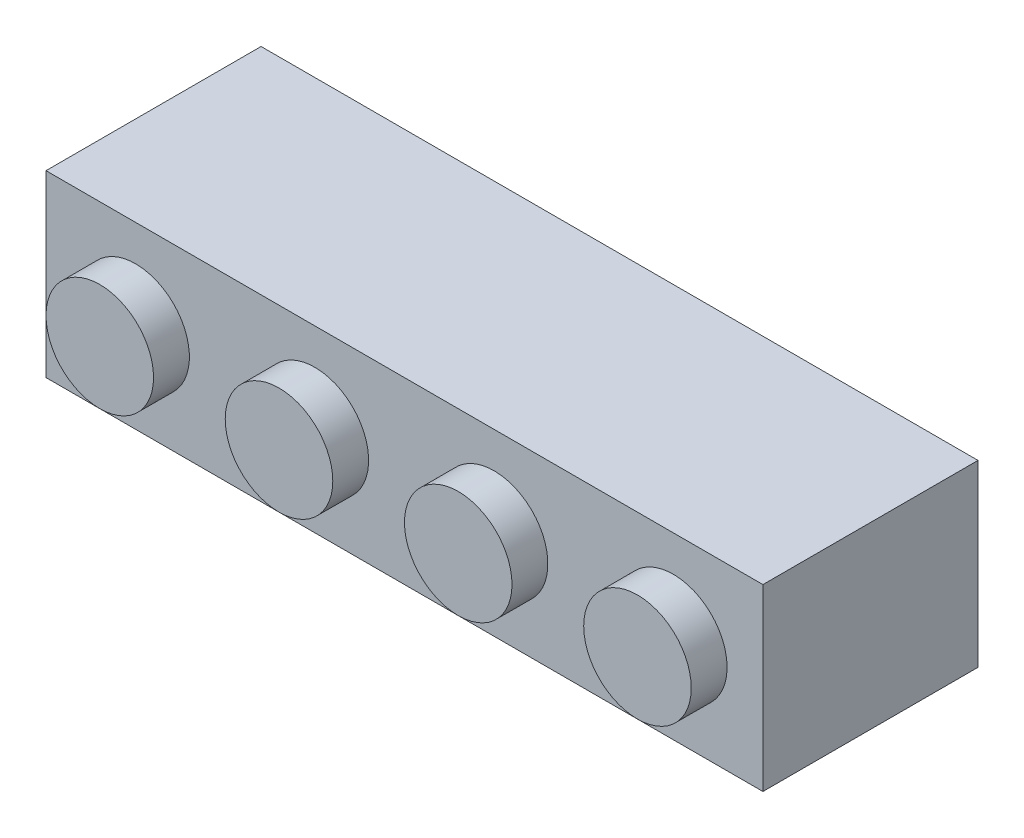
ISO-10303-21;
HEADER;
FILE_DESCRIPTION(('STEP AP214'),'2;1');
FILE_NAME('part.step','',(''),(''),'','','');
FILE_SCHEMA(('AUTOMOTIVE_DESIGN { 1 0 10303 214 1 1 1 1 }'));
ENDSEC;
DATA;
#1=APPLICATION_CONTEXT('core data for automotive mechanical design processes');
#2=APPLICATION_PROTOCOL_DEFINITION('international standard','automotive_design',2000,#1);
#3=PRODUCT_CONTEXT('',#1,'mechanical');
#4=PRODUCT('Part','Part','',(#3));
#5=PRODUCT_RELATED_PRODUCT_CATEGORY('part','',(#4));
#6=PRODUCT_DEFINITION_FORMATION('','',#4);
#7=PRODUCT_DEFINITION_CONTEXT('part definition',#1,'design');
#8=PRODUCT_DEFINITION('design','',#6,#7);
#9=PRODUCT_DEFINITION_SHAPE('','',#8);
#10=(LENGTH_UNIT() NAMED_UNIT(*) SI_UNIT(.MILLI.,.METRE.));
#11=(NAMED_UNIT(*) PLANE_ANGLE_UNIT() SI_UNIT($,.RADIAN.));
#12=(NAMED_UNIT(*) SI_UNIT($,.STERADIAN.) SOLID_ANGLE_UNIT());
#13=UNCERTAINTY_MEASURE_WITH_UNIT(LENGTH_MEASURE(1.E-05),#10,'distance_accuracy_value','');
#14=(GEOMETRIC_REPRESENTATION_CONTEXT(3) GLOBAL_UNCERTAINTY_ASSIGNED_CONTEXT((#13)) GLOBAL_UNIT_ASSIGNED_CONTEXT((#10,
#11,#12)) REPRESENTATION_CONTEXT('',''));
#15=CARTESIAN_POINT('',(0.,0.,0.));
#16=DIRECTION('',(0.,0.,1.));
#17=DIRECTION('',(1.,0.,0.));
#18=AXIS2_PLACEMENT_3D('',#15,#16,#17);
#19=CARTESIAN_POINT('',(0.,0.,8.));
#20=DIRECTION('',(0.,0.,-1.));
#21=DIRECTION('',(-1.,0.,0.));
#22=AXIS2_PLACEMENT_3D('',#19,#20,#21);
#23=PLANE('',#22);
#24=CARTESIAN_POINT('',(16.,4.,8.));
#25=DIRECTION('',(0.,0.,-1.));
#26=DIRECTION('',(-1.,0.,0.));
#27=AXIS2_PLACEMENT_3D('',#24,#25,#26);
#28=CIRCLE('',#27,1.6);
#29=CARTESIAN_POINT('',(14.4,4.,8.));
#30=VERTEX_POINT('',#29);
#31=EDGE_CURVE('E515',#30,#30,#28,.T.);
#32=ORIENTED_EDGE('',*,*,#31,.F.);
#33=EDGE_LOOP('',(#32));
#34=FACE_BOUND('',#33,.T.);
#35=CARTESIAN_POINT('',(28.,4.,8.));
#36=DIRECTION('',(0.,0.,-1.));
#37=DIRECTION('',(-1.,0.,0.));
#38=AXIS2_PLACEMENT_3D('',#35,#36,#37);
#39=CIRCLE('',#38,0.800000000000001);
#40=CARTESIAN_POINT('',(27.2,4.,8.));
#41=VERTEX_POINT('',#40);
#42=EDGE_CURVE('E140',#41,#41,#39,.F.);
#43=ORIENTED_EDGE('',*,*,#42,.T.);
#44=EDGE_LOOP('',(#43));
#45=FACE_BOUND('',#44,.T.);
#46=CARTESIAN_POINT('',(20.,4.,8.));
#47=DIRECTION('',(0.,0.,-1.));
#48=DIRECTION('',(-1.,0.,0.));
#49=AXIS2_PLACEMENT_3D('',#46,#47,#48);
#50=CIRCLE('',#49,0.800000000000001);
#51=CARTESIAN_POINT('',(19.2,4.,8.));
#52=VERTEX_POINT('',#51);
#53=EDGE_CURVE('E135',#52,#52,#50,.F.);
#54=ORIENTED_EDGE('',*,*,#53,.T.);
#55=EDGE_LOOP('',(#54));
#56=FACE_BOUND('',#55,.T.);
#57=CARTESIAN_POINT('',(12.,4.,8.));
#58=DIRECTION('',(0.,0.,-1.));
#59=DIRECTION('',(-1.,0.,0.));
#60=AXIS2_PLACEMENT_3D('',#57,#58,#59);
#61=CIRCLE('',#60,0.800000000000001);
#62=CARTESIAN_POINT('',(11.2,4.,8.));
#63=VERTEX_POINT('',#62);
#64=EDGE_CURVE('E132',#63,#63,#61,.F.);
#65=ORIENTED_EDGE('',*,*,#64,.T.);
#66=EDGE_LOOP('',(#65));
#67=FACE_BOUND('',#66,.T.);
#68=DIRECTION('',(0.,-1.,0.));
#69=VECTOR('',#68,1.);
#70=CARTESIAN_POINT('',(1.6,0.,8.));
#71=LINE('',#70,#69);
#72=CARTESIAN_POINT('',(1.6,6.4,8.));
#73=VERTEX_POINT('',#72);
#74=CARTESIAN_POINT('',(1.6,1.6,8.));
#75=VERTEX_POINT('',#74);
#76=EDGE_CURVE('E118',#73,#75,#71,.T.);
#77=ORIENTED_EDGE('',*,*,#76,.F.);
#78=DIRECTION('',(-1.,0.,0.));
#79=VECTOR('',#78,1.);
#80=CARTESIAN_POINT('',(0.,6.4,8.));
#81=LINE('',#80,#79);
#82=CARTESIAN_POINT('',(30.4,6.4,8.));
#83=VERTEX_POINT('',#82);
#84=EDGE_CURVE('E126',#83,#73,#81,.T.);
#85=ORIENTED_EDGE('',*,*,#84,.F.);
#86=DIRECTION('',(0.,1.,0.));
#87=VECTOR('',#86,1.);
#88=CARTESIAN_POINT('',(30.4,0.,8.));
#89=LINE('',#88,#87);
#90=CARTESIAN_POINT('',(30.4,1.6,8.));
#91=VERTEX_POINT('',#90);
#92=EDGE_CURVE('E117',#91,#83,#89,.T.);
#93=ORIENTED_EDGE('',*,*,#92,.F.);
#94=DIRECTION('',(1.,0.,0.));
#95=VECTOR('',#94,1.);
#96=CARTESIAN_POINT('',(0.,1.6,8.));
#97=LINE('',#96,#95);
#98=EDGE_CURVE('E107',#75,#91,#97,.T.);
#99=ORIENTED_EDGE('',*,*,#98,.F.);
#100=EDGE_LOOP('',(#77,#85,#93,#99));
#101=FACE_BOUND('',#100,.T.);
#102=CARTESIAN_POINT('',(4.,4.,8.));
#103=DIRECTION('',(0.,0.,-1.));
#104=DIRECTION('',(-1.,0.,0.));
#105=AXIS2_PLACEMENT_3D('',#102,#103,#104);
#106=CIRCLE('',#105,0.800000000000001);
#107=CARTESIAN_POINT('',(3.2,4.,8.));
#108=VERTEX_POINT('',#107);
#109=EDGE_CURVE('E136',#108,#108,#106,.F.);
#110=ORIENTED_EDGE('',*,*,#109,.T.);
#111=EDGE_LOOP('',(#110));
#112=FACE_BOUND('',#111,.T.);
#113=CARTESIAN_POINT('',(8.,4.,8.));
#114=DIRECTION('',(0.,0.,-1.));
#115=DIRECTION('',(-1.,0.,0.));
#116=AXIS2_PLACEMENT_3D('',#113,#114,#115);
#117=CIRCLE('',#116,1.6);
#118=CARTESIAN_POINT('',(6.4,4.,8.));
#119=VERTEX_POINT('',#118);
#120=EDGE_CURVE('E526',#119,#119,#117,.T.);
#121=ORIENTED_EDGE('',*,*,#120,.F.);
#122=EDGE_LOOP('',(#121));
#123=FACE_BOUND('',#122,.T.);
#124=CARTESIAN_POINT('',(24.,4.,8.));
#125=DIRECTION('',(0.,0.,-1.));
#126=DIRECTION('',(-1.,0.,0.));
#127=AXIS2_PLACEMENT_3D('',#124,#125,#126);
#128=CIRCLE('',#127,1.6);
#129=CARTESIAN_POINT('',(22.4,4.,8.));
#130=VERTEX_POINT('',#129);
#131=EDGE_CURVE('E516',#130,#130,#128,.T.);
#132=ORIENTED_EDGE('',*,*,#131,.F.);
#133=EDGE_LOOP('',(#132));
#134=FACE_BOUND('',#133,.T.);
#135=ADVANCED_FACE('F32',(#34,#45,#56,#67,#101,#112,#123,#134),#23,.T.);
#136=CARTESIAN_POINT('',(0.,0.,0.));
#137=DIRECTION('',(0.,0.,-1.));
#138=DIRECTION('',(-1.,0.,0.));
#139=AXIS2_PLACEMENT_3D('',#136,#137,#138);
#140=PLANE('',#139);
#141=DIRECTION('',(0.,-1.,0.));
#142=VECTOR('',#141,1.);
#143=CARTESIAN_POINT('',(0.,0.,0.));
#144=LINE('',#143,#142);
#145=CARTESIAN_POINT('',(0.,8.,0.));
#146=VERTEX_POINT('',#145);
#147=CARTESIAN_POINT('',(0.,0.,0.));
#148=VERTEX_POINT('',#147);
#149=EDGE_CURVE('E173',#146,#148,#144,.T.);
#150=ORIENTED_EDGE('',*,*,#149,.F.);
#151=DIRECTION('',(-1.,0.,0.));
#152=VECTOR('',#151,1.);
#153=CARTESIAN_POINT('',(0.,8.,0.));
#154=LINE('',#153,#152);
#155=CARTESIAN_POINT('',(32.,8.,0.));
#156=VERTEX_POINT('',#155);
#157=EDGE_CURVE('E77',#156,#146,#154,.T.);
#158=ORIENTED_EDGE('',*,*,#157,.F.);
#159=DIRECTION('',(0.,1.,0.));
#160=VECTOR('',#159,1.);
#161=CARTESIAN_POINT('',(32.,0.,0.));
#162=LINE('',#161,#160);
#163=CARTESIAN_POINT('',(32.,0.,0.));
#164=VERTEX_POINT('',#163);
#165=EDGE_CURVE('E185',#164,#156,#162,.T.);
#166=ORIENTED_EDGE('',*,*,#165,.F.);
#167=DIRECTION('',(1.,0.,0.));
#168=VECTOR('',#167,1.);
#169=CARTESIAN_POINT('',(0.,0.,0.));
#170=LINE('',#169,#168);
#171=EDGE_CURVE('E183',#148,#164,#170,.T.);
#172=ORIENTED_EDGE('',*,*,#171,.F.);
#173=EDGE_LOOP('',(#150,#158,#166,#172));
#174=FACE_BOUND('',#173,.T.);
#175=DIRECTION('',(-1.,0.,0.));
#176=VECTOR('',#175,1.);
#177=CARTESIAN_POINT('',(0.,6.4,0.));
#178=LINE('',#177,#176);
#179=CARTESIAN_POINT('',(30.4,6.4,0.));
#180=VERTEX_POINT('',#179);
#181=CARTESIAN_POINT('',(1.6,6.4,0.));
#182=VERTEX_POINT('',#181);
#183=EDGE_CURVE('E163',#180,#182,#178,.T.);
#184=ORIENTED_EDGE('',*,*,#183,.T.);
#185=DIRECTION('',(0.,-1.,0.));
#186=VECTOR('',#185,1.);
#187=CARTESIAN_POINT('',(1.6,0.,0.));
#188=LINE('',#187,#186);
#189=CARTESIAN_POINT('',(1.6,1.6,0.));
#190=VERTEX_POINT('',#189);
#191=EDGE_CURVE('E150',#182,#190,#188,.T.);
#192=ORIENTED_EDGE('',*,*,#191,.T.);
#193=DIRECTION('',(1.,0.,0.));
#194=VECTOR('',#193,1.);
#195=CARTESIAN_POINT('',(0.,1.6,0.));
#196=LINE('',#195,#194);
#197=CARTESIAN_POINT('',(30.4,1.6,0.));
#198=VERTEX_POINT('',#197);
#199=EDGE_CURVE('E162',#190,#198,#196,.T.);
#200=ORIENTED_EDGE('',*,*,#199,.T.);
#201=DIRECTION('',(0.,1.,0.));
#202=VECTOR('',#201,1.);
#203=CARTESIAN_POINT('',(30.4,0.,0.));
#204=LINE('',#203,#202);
#205=EDGE_CURVE('E47',#198,#180,#204,.T.);
#206=ORIENTED_EDGE('',*,*,#205,.T.);
#207=EDGE_LOOP('',(#184,#192,#200,#206));
#208=FACE_BOUND('',#207,.T.);
#209=ADVANCED_FACE('F215',(#174,#208),#140,.T.);
#210=CARTESIAN_POINT('',(0.,0.,9.6));
#211=DIRECTION('',(0.,0.,-1.));
#212=DIRECTION('',(-1.,0.,0.));
#213=AXIS2_PLACEMENT_3D('',#210,#211,#212);
#214=PLANE('',#213);
#215=CARTESIAN_POINT('',(4.,4.,9.6));
#216=DIRECTION('',(0.,0.,-1.));
#217=DIRECTION('',(-1.,0.,0.));
#218=AXIS2_PLACEMENT_3D('',#215,#216,#217);
#219=CIRCLE('',#218,2.4);
#220=CARTESIAN_POINT('',(1.6,4.,9.6));
#221=VERTEX_POINT('',#220);
#222=EDGE_CURVE('E196',#221,#221,#219,.F.);
#223=ORIENTED_EDGE('',*,*,#222,.F.);
#224=EDGE_LOOP('',(#223));
#225=FACE_BOUND('',#224,.T.);
#226=DIRECTION('',(0.,-1.,0.));
#227=VECTOR('',#226,1.);
#228=CARTESIAN_POINT('',(0.,0.,9.6));
#229=LINE('',#228,#227);
#230=CARTESIAN_POINT('',(0.,8.,9.6));
#231=VERTEX_POINT('',#230);
#232=CARTESIAN_POINT('',(0.,0.,9.6));
#233=VERTEX_POINT('',#232);
#234=EDGE_CURVE('E174',#231,#233,#229,.T.);
#235=ORIENTED_EDGE('',*,*,#234,.T.);
#236=DIRECTION('',(1.,0.,0.));
#237=VECTOR('',#236,1.);
#238=CARTESIAN_POINT('',(0.,0.,9.6));
#239=LINE('',#238,#237);
#240=CARTESIAN_POINT('',(32.,0.,9.6));
#241=VERTEX_POINT('',#240);
#242=EDGE_CURVE('E85',#233,#241,#239,.T.);
#243=ORIENTED_EDGE('',*,*,#242,.T.);
#244=DIRECTION('',(0.,1.,0.));
#245=VECTOR('',#244,1.);
#246=CARTESIAN_POINT('',(32.,0.,9.6));
#247=LINE('',#246,#245);
#248=CARTESIAN_POINT('',(32.,8.,9.6));
#249=VERTEX_POINT('',#248);
#250=EDGE_CURVE('E177',#241,#249,#247,.T.);
#251=ORIENTED_EDGE('',*,*,#250,.T.);
#252=DIRECTION('',(-1.,0.,0.));
#253=VECTOR('',#252,1.);
#254=CARTESIAN_POINT('',(0.,8.,9.6));
#255=LINE('',#254,#253);
#256=EDGE_CURVE('E56',#249,#231,#255,.T.);
#257=ORIENTED_EDGE('',*,*,#256,.T.);
#258=EDGE_LOOP('',(#235,#243,#251,#257));
#259=FACE_BOUND('',#258,.T.);
#260=CARTESIAN_POINT('',(12.,4.,9.6));
#261=DIRECTION('',(0.,0.,-1.));
#262=DIRECTION('',(-1.,0.,0.));
#263=AXIS2_PLACEMENT_3D('',#260,#261,#262);
#264=CIRCLE('',#263,2.4);
#265=CARTESIAN_POINT('',(9.6,4.,9.6));
#266=VERTEX_POINT('',#265);
#267=EDGE_CURVE('E199',#266,#266,#264,.F.);
#268=ORIENTED_EDGE('',*,*,#267,.F.);
#269=EDGE_LOOP('',(#268));
#270=FACE_BOUND('',#269,.T.);
#271=CARTESIAN_POINT('',(20.,4.,9.6));
#272=DIRECTION('',(0.,0.,-1.));
#273=DIRECTION('',(-1.,0.,0.));
#274=AXIS2_PLACEMENT_3D('',#271,#272,#273);
#275=CIRCLE('',#274,2.4);
#276=CARTESIAN_POINT('',(17.6,4.,9.6));
#277=VERTEX_POINT('',#276);
#278=EDGE_CURVE('E202',#277,#277,#275,.F.);
#279=ORIENTED_EDGE('',*,*,#278,.F.);
#280=EDGE_LOOP('',(#279));
#281=FACE_BOUND('',#280,.T.);
#282=CARTESIAN_POINT('',(28.,4.,9.6));
#283=DIRECTION('',(0.,0.,-1.));
#284=DIRECTION('',(-1.,0.,0.));
#285=AXIS2_PLACEMENT_3D('',#282,#283,#284);
#286=CIRCLE('',#285,2.4);
#287=CARTESIAN_POINT('',(25.6,4.,9.6));
#288=VERTEX_POINT('',#287);
#289=EDGE_CURVE('E40',#288,#288,#286,.F.);
#290=ORIENTED_EDGE('',*,*,#289,.F.);
#291=EDGE_LOOP('',(#290));
#292=FACE_BOUND('',#291,.T.);
#293=ADVANCED_FACE('F212',(#225,#259,#270,#281,#292),#214,.F.);
#294=CARTESIAN_POINT('',(0.,0.,9.6));
#295=DIRECTION('',(1.,0.,0.));
#296=DIRECTION('',(0.,0.,-1.));
#297=AXIS2_PLACEMENT_3D('',#294,#295,#296);
#298=PLANE('',#297);
#299=ORIENTED_EDGE('',*,*,#149,.T.);
#300=DIRECTION('',(0.,0.,-1.));
#301=VECTOR('',#300,1.);
#302=CARTESIAN_POINT('',(0.,0.,9.6));
#303=LINE('',#302,#301);
#304=EDGE_CURVE('E194',#233,#148,#303,.T.);
#305=ORIENTED_EDGE('',*,*,#304,.F.);
#306=ORIENTED_EDGE('',*,*,#234,.F.);
#307=DIRECTION('',(0.,0.,-1.));
#308=VECTOR('',#307,1.);
#309=CARTESIAN_POINT('',(0.,8.,9.6));
#310=LINE('',#309,#308);
#311=EDGE_CURVE('E180',#231,#146,#310,.T.);
#312=ORIENTED_EDGE('',*,*,#311,.T.);
#313=EDGE_LOOP('',(#299,#305,#306,#312));
#314=FACE_BOUND('',#313,.T.);
#315=ADVANCED_FACE('F214',(#314),#298,.F.);
#316=CARTESIAN_POINT('',(0.,0.,9.6));
#317=DIRECTION('',(0.,1.,0.));
#318=DIRECTION('',(0.,0.,1.));
#319=AXIS2_PLACEMENT_3D('',#316,#317,#318);
#320=PLANE('',#319);
#321=ORIENTED_EDGE('',*,*,#171,.T.);
#322=DIRECTION('',(0.,0.,-1.));
#323=VECTOR('',#322,1.);
#324=CARTESIAN_POINT('',(32.,0.,9.6));
#325=LINE('',#324,#323);
#326=EDGE_CURVE('E191',#241,#164,#325,.T.);
#327=ORIENTED_EDGE('',*,*,#326,.F.);
#328=ORIENTED_EDGE('',*,*,#242,.F.);
#329=ORIENTED_EDGE('',*,*,#304,.T.);
#330=EDGE_LOOP('',(#321,#327,#328,#329));
#331=FACE_BOUND('',#330,.T.);
#332=ADVANCED_FACE('F222',(#331),#320,.F.);
#333=CARTESIAN_POINT('',(32.,0.,9.6));
#334=DIRECTION('',(-1.,0.,0.));
#335=DIRECTION('',(0.,0.,1.));
#336=AXIS2_PLACEMENT_3D('',#333,#334,#335);
#337=PLANE('',#336);
#338=ORIENTED_EDGE('',*,*,#165,.T.);
#339=DIRECTION('',(0.,0.,-1.));
#340=VECTOR('',#339,1.);
#341=CARTESIAN_POINT('',(32.,8.,9.6));
#342=LINE('',#341,#340);
#343=EDGE_CURVE('E189',#249,#156,#342,.T.);
#344=ORIENTED_EDGE('',*,*,#343,.F.);
#345=ORIENTED_EDGE('',*,*,#250,.F.);
#346=ORIENTED_EDGE('',*,*,#326,.T.);
#347=EDGE_LOOP('',(#338,#344,#345,#346));
#348=FACE_BOUND('',#347,.T.);
#349=ADVANCED_FACE('F303',(#348),#337,.F.);
#350=CARTESIAN_POINT('',(0.,8.,9.6));
#351=DIRECTION('',(0.,-1.,0.));
#352=DIRECTION('',(0.,0.,-1.));
#353=AXIS2_PLACEMENT_3D('',#350,#351,#352);
#354=PLANE('',#353);
#355=ORIENTED_EDGE('',*,*,#157,.T.);
#356=ORIENTED_EDGE('',*,*,#311,.F.);
#357=ORIENTED_EDGE('',*,*,#256,.F.);
#358=ORIENTED_EDGE('',*,*,#343,.T.);
#359=EDGE_LOOP('',(#355,#356,#357,#358));
#360=FACE_BOUND('',#359,.T.);
#361=ADVANCED_FACE('F298',(#360),#354,.F.);
#362=CARTESIAN_POINT('',(4.,4.,11.2));
#363=DIRECTION('',(0.,0.,-1.));
#364=DIRECTION('',(-1.,0.,0.));
#365=AXIS2_PLACEMENT_3D('',#362,#363,#364);
#366=CYLINDRICAL_SURFACE('',#365,2.4);
#367=CARTESIAN_POINT('',(4.,4.,11.2));
#368=DIRECTION('',(0.,0.,1.));
#369=DIRECTION('',(1.,0.,0.));
#370=AXIS2_PLACEMENT_3D('',#367,#368,#369);
#371=CIRCLE('',#370,2.4);
#372=CARTESIAN_POINT('',(6.4,4.,11.2));
#373=VERTEX_POINT('',#372);
#374=EDGE_CURVE('E170',#373,#373,#371,.T.);
#375=ORIENTED_EDGE('',*,*,#374,.F.);
#376=EDGE_LOOP('',(#375));
#377=FACE_BOUND('',#376,.T.);
#378=ORIENTED_EDGE('',*,*,#222,.T.);
#379=EDGE_LOOP('',(#378));
#380=FACE_BOUND('',#379,.T.);
#381=ADVANCED_FACE('F295',(#377,#380),#366,.T.);
#382=CARTESIAN_POINT('',(4.,4.,11.2));
#383=DIRECTION('',(0.,0.,1.));
#384=DIRECTION('',(1.,0.,0.));
#385=AXIS2_PLACEMENT_3D('',#382,#383,#384);
#386=PLANE('',#385);
#387=ORIENTED_EDGE('',*,*,#374,.T.);
#388=EDGE_LOOP('',(#387));
#389=FACE_BOUND('',#388,.T.);
#390=ADVANCED_FACE('F292',(#389),#386,.T.);
#391=CARTESIAN_POINT('',(12.,4.,11.2));
#392=DIRECTION('',(0.,0.,-1.));
#393=DIRECTION('',(-1.,0.,0.));
#394=AXIS2_PLACEMENT_3D('',#391,#392,#393);
#395=CYLINDRICAL_SURFACE('',#394,2.4);
#396=CARTESIAN_POINT('',(12.,4.,11.2));
#397=DIRECTION('',(0.,0.,1.));
#398=DIRECTION('',(1.,0.,0.));
#399=AXIS2_PLACEMENT_3D('',#396,#397,#398);
#400=CIRCLE('',#399,2.4);
#401=CARTESIAN_POINT('',(14.4,4.,11.2));
#402=VERTEX_POINT('',#401);
#403=EDGE_CURVE('E159',#402,#402,#400,.T.);
#404=ORIENTED_EDGE('',*,*,#403,.F.);
#405=EDGE_LOOP('',(#404));
#406=FACE_BOUND('',#405,.T.);
#407=ORIENTED_EDGE('',*,*,#267,.T.);
#408=EDGE_LOOP('',(#407));
#409=FACE_BOUND('',#408,.T.);
#410=ADVANCED_FACE('F288',(#406,#409),#395,.T.);
#411=CARTESIAN_POINT('',(12.,4.,11.2));
#412=DIRECTION('',(0.,0.,1.));
#413=DIRECTION('',(1.,0.,0.));
#414=AXIS2_PLACEMENT_3D('',#411,#412,#413);
#415=PLANE('',#414);
#416=ORIENTED_EDGE('',*,*,#403,.T.);
#417=EDGE_LOOP('',(#416));
#418=FACE_BOUND('',#417,.T.);
#419=ADVANCED_FACE('F284',(#418),#415,.T.);
#420=CARTESIAN_POINT('',(20.,4.,11.2));
#421=DIRECTION('',(0.,0.,1.));
#422=DIRECTION('',(1.,0.,0.));
#423=AXIS2_PLACEMENT_3D('',#420,#421,#422);
#424=PLANE('',#423);
#425=CARTESIAN_POINT('',(20.,4.,11.2));
#426=DIRECTION('',(0.,0.,1.));
#427=DIRECTION('',(1.,0.,0.));
#428=AXIS2_PLACEMENT_3D('',#425,#426,#427);
#429=CIRCLE('',#428,2.4);
#430=CARTESIAN_POINT('',(22.4,4.,11.2));
#431=VERTEX_POINT('',#430);
#432=EDGE_CURVE('E205',#431,#431,#429,.T.);
#433=ORIENTED_EDGE('',*,*,#432,.T.);
#434=EDGE_LOOP('',(#433));
#435=FACE_BOUND('',#434,.T.);
#436=ADVANCED_FACE('F287',(#435),#424,.T.);
#437=CARTESIAN_POINT('',(20.,4.,11.2));
#438=DIRECTION('',(0.,0.,-1.));
#439=DIRECTION('',(-1.,0.,0.));
#440=AXIS2_PLACEMENT_3D('',#437,#438,#439);
#441=CYLINDRICAL_SURFACE('',#440,2.4);
#442=ORIENTED_EDGE('',*,*,#432,.F.);
#443=EDGE_LOOP('',(#442));
#444=FACE_BOUND('',#443,.T.);
#445=ORIENTED_EDGE('',*,*,#278,.T.);
#446=EDGE_LOOP('',(#445));
#447=FACE_BOUND('',#446,.T.);
#448=ADVANCED_FACE('F315',(#444,#447),#441,.T.);
#449=CARTESIAN_POINT('',(28.,4.,11.2));
#450=DIRECTION('',(0.,0.,1.));
#451=DIRECTION('',(1.,0.,0.));
#452=AXIS2_PLACEMENT_3D('',#449,#450,#451);
#453=PLANE('',#452);
#454=CARTESIAN_POINT('',(28.,4.,11.2));
#455=DIRECTION('',(0.,0.,1.));
#456=DIRECTION('',(1.,0.,0.));
#457=AXIS2_PLACEMENT_3D('',#454,#455,#456);
#458=CIRCLE('',#457,2.4);
#459=CARTESIAN_POINT('',(30.4,4.,11.2));
#460=VERTEX_POINT('',#459);
#461=EDGE_CURVE('E11',#460,#460,#458,.T.);
#462=ORIENTED_EDGE('',*,*,#461,.T.);
#463=EDGE_LOOP('',(#462));
#464=FACE_BOUND('',#463,.T.);
#465=ADVANCED_FACE('F34',(#464),#453,.T.);
#466=CARTESIAN_POINT('',(28.,4.,11.2));
#467=DIRECTION('',(0.,0.,-1.));
#468=DIRECTION('',(-1.,0.,0.));
#469=AXIS2_PLACEMENT_3D('',#466,#467,#468);
#470=CYLINDRICAL_SURFACE('',#469,2.4);
#471=ORIENTED_EDGE('',*,*,#461,.F.);
#472=EDGE_LOOP('',(#471));
#473=FACE_BOUND('',#472,.T.);
#474=ORIENTED_EDGE('',*,*,#289,.T.);
#475=EDGE_LOOP('',(#474));
#476=FACE_BOUND('',#475,.T.);
#477=ADVANCED_FACE('F210',(#473,#476),#470,.T.);
#478=CARTESIAN_POINT('',(1.6,0.,9.6));
#479=DIRECTION('',(1.,0.,0.));
#480=DIRECTION('',(0.,0.,-1.));
#481=AXIS2_PLACEMENT_3D('',#478,#479,#480);
#482=PLANE('',#481);
#483=ORIENTED_EDGE('',*,*,#191,.F.);
#484=DIRECTION('',(0.,0.,-1.));
#485=VECTOR('',#484,1.);
#486=CARTESIAN_POINT('',(1.6,6.4,9.6));
#487=LINE('',#486,#485);
#488=EDGE_CURVE('E128',#73,#182,#487,.T.);
#489=ORIENTED_EDGE('',*,*,#488,.F.);
#490=ORIENTED_EDGE('',*,*,#76,.T.);
#491=DIRECTION('',(0.,0.,-1.));
#492=VECTOR('',#491,1.);
#493=CARTESIAN_POINT('',(1.6,1.6,9.6));
#494=LINE('',#493,#492);
#495=EDGE_CURVE('E112',#75,#190,#494,.T.);
#496=ORIENTED_EDGE('',*,*,#495,.T.);
#497=EDGE_LOOP('',(#483,#489,#490,#496));
#498=FACE_BOUND('',#497,.T.);
#499=ADVANCED_FACE('F240',(#498),#482,.T.);
#500=CARTESIAN_POINT('',(0.,1.6,9.6));
#501=DIRECTION('',(0.,1.,0.));
#502=DIRECTION('',(0.,0.,1.));
#503=AXIS2_PLACEMENT_3D('',#500,#501,#502);
#504=PLANE('',#503);
#505=ORIENTED_EDGE('',*,*,#199,.F.);
#506=ORIENTED_EDGE('',*,*,#495,.F.);
#507=ORIENTED_EDGE('',*,*,#98,.T.);
#508=DIRECTION('',(0.,0.,-1.));
#509=VECTOR('',#508,1.);
#510=CARTESIAN_POINT('',(30.4,1.6,9.6));
#511=LINE('',#510,#509);
#512=EDGE_CURVE('E109',#91,#198,#511,.T.);
#513=ORIENTED_EDGE('',*,*,#512,.T.);
#514=EDGE_LOOP('',(#505,#506,#507,#513));
#515=FACE_BOUND('',#514,.T.);
#516=ADVANCED_FACE('F108',(#515),#504,.T.);
#517=CARTESIAN_POINT('',(30.4,0.,9.6));
#518=DIRECTION('',(-1.,0.,0.));
#519=DIRECTION('',(0.,0.,1.));
#520=AXIS2_PLACEMENT_3D('',#517,#518,#519);
#521=PLANE('',#520);
#522=ORIENTED_EDGE('',*,*,#205,.F.);
#523=ORIENTED_EDGE('',*,*,#512,.F.);
#524=ORIENTED_EDGE('',*,*,#92,.T.);
#525=DIRECTION('',(0.,0.,-1.));
#526=VECTOR('',#525,1.);
#527=CARTESIAN_POINT('',(30.4,6.4,9.6));
#528=LINE('',#527,#526);
#529=EDGE_CURVE('E122',#83,#180,#528,.T.);
#530=ORIENTED_EDGE('',*,*,#529,.T.);
#531=EDGE_LOOP('',(#522,#523,#524,#530));
#532=FACE_BOUND('',#531,.T.);
#533=ADVANCED_FACE('F120',(#532),#521,.T.);
#534=CARTESIAN_POINT('',(0.,6.4,9.6));
#535=DIRECTION('',(0.,-1.,0.));
#536=DIRECTION('',(0.,0.,-1.));
#537=AXIS2_PLACEMENT_3D('',#534,#535,#536);
#538=PLANE('',#537);
#539=ORIENTED_EDGE('',*,*,#183,.F.);
#540=ORIENTED_EDGE('',*,*,#529,.F.);
#541=ORIENTED_EDGE('',*,*,#84,.T.);
#542=ORIENTED_EDGE('',*,*,#488,.T.);
#543=EDGE_LOOP('',(#539,#540,#541,#542));
#544=FACE_BOUND('',#543,.T.);
#545=ADVANCED_FACE('F248',(#544),#538,.T.);
#546=CARTESIAN_POINT('',(4.,4.,11.2));
#547=DIRECTION('',(0.,0.,-1.));
#548=DIRECTION('',(-1.,0.,0.));
#549=AXIS2_PLACEMENT_3D('',#546,#547,#548);
#550=CYLINDRICAL_SURFACE('',#549,0.800000000000001);
#551=CARTESIAN_POINT('',(4.,4.,9.6));
#552=DIRECTION('',(0.,0.,1.));
#553=DIRECTION('',(1.,0.,0.));
#554=AXIS2_PLACEMENT_3D('',#551,#552,#553);
#555=CIRCLE('',#554,0.800000000000001);
#556=CARTESIAN_POINT('',(4.8,4.,9.6));
#557=VERTEX_POINT('',#556);
#558=EDGE_CURVE('E147',#557,#557,#555,.T.);
#559=ORIENTED_EDGE('',*,*,#558,.T.);
#560=EDGE_LOOP('',(#559));
#561=FACE_BOUND('',#560,.T.);
#562=ORIENTED_EDGE('',*,*,#109,.F.);
#563=EDGE_LOOP('',(#562));
#564=FACE_BOUND('',#563,.T.);
#565=ADVANCED_FACE('F251',(#561,#564),#550,.F.);
#566=CARTESIAN_POINT('',(4.,4.,9.6));
#567=DIRECTION('',(0.,0.,1.));
#568=DIRECTION('',(1.,0.,0.));
#569=AXIS2_PLACEMENT_3D('',#566,#567,#568);
#570=PLANE('',#569);
#571=ORIENTED_EDGE('',*,*,#558,.F.);
#572=EDGE_LOOP('',(#571));
#573=FACE_BOUND('',#572,.T.);
#574=ADVANCED_FACE('F255',(#573),#570,.F.);
#575=CARTESIAN_POINT('',(12.,4.,11.2));
#576=DIRECTION('',(0.,0.,-1.));
#577=DIRECTION('',(-1.,0.,0.));
#578=AXIS2_PLACEMENT_3D('',#575,#576,#577);
#579=CYLINDRICAL_SURFACE('',#578,0.800000000000001);
#580=CARTESIAN_POINT('',(12.,4.,9.6));
#581=DIRECTION('',(0.,0.,1.));
#582=DIRECTION('',(1.,0.,0.));
#583=AXIS2_PLACEMENT_3D('',#580,#581,#582);
#584=CIRCLE('',#583,0.800000000000001);
#585=CARTESIAN_POINT('',(12.8,4.,9.6));
#586=VERTEX_POINT('',#585);
#587=EDGE_CURVE('E151',#586,#586,#584,.T.);
#588=ORIENTED_EDGE('',*,*,#587,.T.);
#589=EDGE_LOOP('',(#588));
#590=FACE_BOUND('',#589,.T.);
#591=ORIENTED_EDGE('',*,*,#64,.F.);
#592=EDGE_LOOP('',(#591));
#593=FACE_BOUND('',#592,.T.);
#594=ADVANCED_FACE('F259',(#590,#593),#579,.F.);
#595=CARTESIAN_POINT('',(12.,4.,9.6));
#596=DIRECTION('',(0.,0.,1.));
#597=DIRECTION('',(1.,0.,0.));
#598=AXIS2_PLACEMENT_3D('',#595,#596,#597);
#599=PLANE('',#598);
#600=ORIENTED_EDGE('',*,*,#587,.F.);
#601=EDGE_LOOP('',(#600));
#602=FACE_BOUND('',#601,.T.);
#603=ADVANCED_FACE('F263',(#602),#599,.F.);
#604=CARTESIAN_POINT('',(20.,4.,9.6));
#605=DIRECTION('',(0.,0.,1.));
#606=DIRECTION('',(1.,0.,0.));
#607=AXIS2_PLACEMENT_3D('',#604,#605,#606);
#608=PLANE('',#607);
#609=CARTESIAN_POINT('',(20.,4.,9.6));
#610=DIRECTION('',(0.,0.,1.));
#611=DIRECTION('',(1.,0.,0.));
#612=AXIS2_PLACEMENT_3D('',#609,#610,#611);
#613=CIRCLE('',#612,0.800000000000001);
#614=CARTESIAN_POINT('',(20.8,4.,9.6));
#615=VERTEX_POINT('',#614);
#616=EDGE_CURVE('E139',#615,#615,#613,.T.);
#617=ORIENTED_EDGE('',*,*,#616,.F.);
#618=EDGE_LOOP('',(#617));
#619=FACE_BOUND('',#618,.T.);
#620=ADVANCED_FACE('F267',(#619),#608,.F.);
#621=CARTESIAN_POINT('',(20.,4.,11.2));
#622=DIRECTION('',(0.,0.,-1.));
#623=DIRECTION('',(-1.,0.,0.));
#624=AXIS2_PLACEMENT_3D('',#621,#622,#623);
#625=CYLINDRICAL_SURFACE('',#624,0.800000000000001);
#626=ORIENTED_EDGE('',*,*,#616,.T.);
#627=EDGE_LOOP('',(#626));
#628=FACE_BOUND('',#627,.T.);
#629=ORIENTED_EDGE('',*,*,#53,.F.);
#630=EDGE_LOOP('',(#629));
#631=FACE_BOUND('',#630,.T.);
#632=ADVANCED_FACE('F271',(#628,#631),#625,.F.);
#633=CARTESIAN_POINT('',(28.,4.,9.6));
#634=DIRECTION('',(0.,0.,1.));
#635=DIRECTION('',(1.,0.,0.));
#636=AXIS2_PLACEMENT_3D('',#633,#634,#635);
#637=PLANE('',#636);
#638=CARTESIAN_POINT('',(28.,4.,9.6));
#639=DIRECTION('',(0.,0.,1.));
#640=DIRECTION('',(1.,0.,0.));
#641=AXIS2_PLACEMENT_3D('',#638,#639,#640);
#642=CIRCLE('',#641,0.800000000000001);
#643=CARTESIAN_POINT('',(28.8,4.,9.6));
#644=VERTEX_POINT('',#643);
#645=EDGE_CURVE('E143',#644,#644,#642,.T.);
#646=ORIENTED_EDGE('',*,*,#645,.F.);
#647=EDGE_LOOP('',(#646));
#648=FACE_BOUND('',#647,.T.);
#649=ADVANCED_FACE('F275',(#648),#637,.F.);
#650=CARTESIAN_POINT('',(28.,4.,11.2));
#651=DIRECTION('',(0.,0.,-1.));
#652=DIRECTION('',(-1.,0.,0.));
#653=AXIS2_PLACEMENT_3D('',#650,#651,#652);
#654=CYLINDRICAL_SURFACE('',#653,0.800000000000001);
#655=ORIENTED_EDGE('',*,*,#645,.T.);
#656=EDGE_LOOP('',(#655));
#657=FACE_BOUND('',#656,.T.);
#658=ORIENTED_EDGE('',*,*,#42,.F.);
#659=EDGE_LOOP('',(#658));
#660=FACE_BOUND('',#659,.T.);
#661=ADVANCED_FACE('F279',(#657,#660),#654,.F.);
#662=CARTESIAN_POINT('',(8.,4.,0.));
#663=DIRECTION('',(0.,0.,1.));
#664=DIRECTION('',(1.,0.,0.));
#665=AXIS2_PLACEMENT_3D('',#662,#663,#664);
#666=CYLINDRICAL_SURFACE('',#665,1.6);
#667=CARTESIAN_POINT('',(8.,4.,0.));
#668=DIRECTION('',(0.,0.,-1.));
#669=DIRECTION('',(-1.,0.,0.));
#670=AXIS2_PLACEMENT_3D('',#667,#668,#669);
#671=CIRCLE('',#670,1.6);
#672=CARTESIAN_POINT('',(6.4,4.,0.));
#673=VERTEX_POINT('',#672);
#674=EDGE_CURVE('E154',#673,#673,#671,.T.);
#675=ORIENTED_EDGE('',*,*,#674,.F.);
#676=EDGE_LOOP('',(#675));
#677=FACE_BOUND('',#676,.T.);
#678=ORIENTED_EDGE('',*,*,#120,.T.);
#679=EDGE_LOOP('',(#678));
#680=FACE_BOUND('',#679,.T.);
#681=ADVANCED_FACE('F238',(#677,#680),#666,.T.);
#682=CARTESIAN_POINT('',(8.,4.,0.));
#683=DIRECTION('',(0.,0.,-1.));
#684=DIRECTION('',(-1.,0.,0.));
#685=AXIS2_PLACEMENT_3D('',#682,#683,#684);
#686=PLANE('',#685);
#687=ORIENTED_EDGE('',*,*,#674,.T.);
#688=EDGE_LOOP('',(#687));
#689=FACE_BOUND('',#688,.T.);
#690=ADVANCED_FACE('F445',(#689),#686,.T.);
#691=CARTESIAN_POINT('',(16.,4.,0.));
#692=DIRECTION('',(0.,0.,1.));
#693=DIRECTION('',(1.,0.,0.));
#694=AXIS2_PLACEMENT_3D('',#691,#692,#693);
#695=CYLINDRICAL_SURFACE('',#694,1.6);
#696=CARTESIAN_POINT('',(16.,4.,0.));
#697=DIRECTION('',(0.,0.,-1.));
#698=DIRECTION('',(-1.,0.,0.));
#699=AXIS2_PLACEMENT_3D('',#696,#697,#698);
#700=CIRCLE('',#699,1.6);
#701=CARTESIAN_POINT('',(14.4,4.,0.));
#702=VERTEX_POINT('',#701);
#703=EDGE_CURVE('E519',#702,#702,#700,.T.);
#704=ORIENTED_EDGE('',*,*,#703,.F.);
#705=EDGE_LOOP('',(#704));
#706=FACE_BOUND('',#705,.T.);
#707=ORIENTED_EDGE('',*,*,#31,.T.);
#708=EDGE_LOOP('',(#707));
#709=FACE_BOUND('',#708,.T.);
#710=ADVANCED_FACE('F453',(#706,#709),#695,.T.);
#711=CARTESIAN_POINT('',(16.,4.,0.));
#712=DIRECTION('',(0.,0.,-1.));
#713=DIRECTION('',(-1.,0.,0.));
#714=AXIS2_PLACEMENT_3D('',#711,#712,#713);
#715=PLANE('',#714);
#716=ORIENTED_EDGE('',*,*,#703,.T.);
#717=EDGE_LOOP('',(#716));
#718=FACE_BOUND('',#717,.T.);
#719=ADVANCED_FACE('F465',(#718),#715,.T.);
#720=CARTESIAN_POINT('',(24.,4.,0.));
#721=DIRECTION('',(0.,0.,1.));
#722=DIRECTION('',(1.,0.,0.));
#723=AXIS2_PLACEMENT_3D('',#720,#721,#722);
#724=CYLINDRICAL_SURFACE('',#723,1.6);
#725=CARTESIAN_POINT('',(24.,4.,0.));
#726=DIRECTION('',(0.,0.,-1.));
#727=DIRECTION('',(-1.,0.,0.));
#728=AXIS2_PLACEMENT_3D('',#725,#726,#727);
#729=CIRCLE('',#728,1.6);
#730=CARTESIAN_POINT('',(22.4,4.,0.));
#731=VERTEX_POINT('',#730);
#732=EDGE_CURVE('E514',#731,#731,#729,.T.);
#733=ORIENTED_EDGE('',*,*,#732,.F.);
#734=EDGE_LOOP('',(#733));
#735=FACE_BOUND('',#734,.T.);
#736=ORIENTED_EDGE('',*,*,#131,.T.);
#737=EDGE_LOOP('',(#736));
#738=FACE_BOUND('',#737,.T.);
#739=ADVANCED_FACE('F474',(#735,#738),#724,.T.);
#740=CARTESIAN_POINT('',(24.,4.,0.));
#741=DIRECTION('',(0.,0.,-1.));
#742=DIRECTION('',(-1.,0.,0.));
#743=AXIS2_PLACEMENT_3D('',#740,#741,#742);
#744=PLANE('',#743);
#745=ORIENTED_EDGE('',*,*,#732,.T.);
#746=EDGE_LOOP('',(#745));
#747=FACE_BOUND('',#746,.T.);
#748=ADVANCED_FACE('F483',(#747),#744,.T.);
#749=CLOSED_SHELL('',(#135,#209,#293,#315,#332,#349,#361,#381,#390,#410,#419,#436,#448,#465,
#477,#499,#516,#533,#545,#565,#574,#594,#603,#620,#632,#649,#661,#681,#690,#710,#719,#739,#748));
#750=MANIFOLD_SOLID_BREP('B2',#749);
#751=ADVANCED_BREP_SHAPE_REPRESENTATION('',(#18,#750),#14);
#752=SHAPE_DEFINITION_REPRESENTATION(#9,#751);
ENDSEC;
END-ISO-10303-21;
